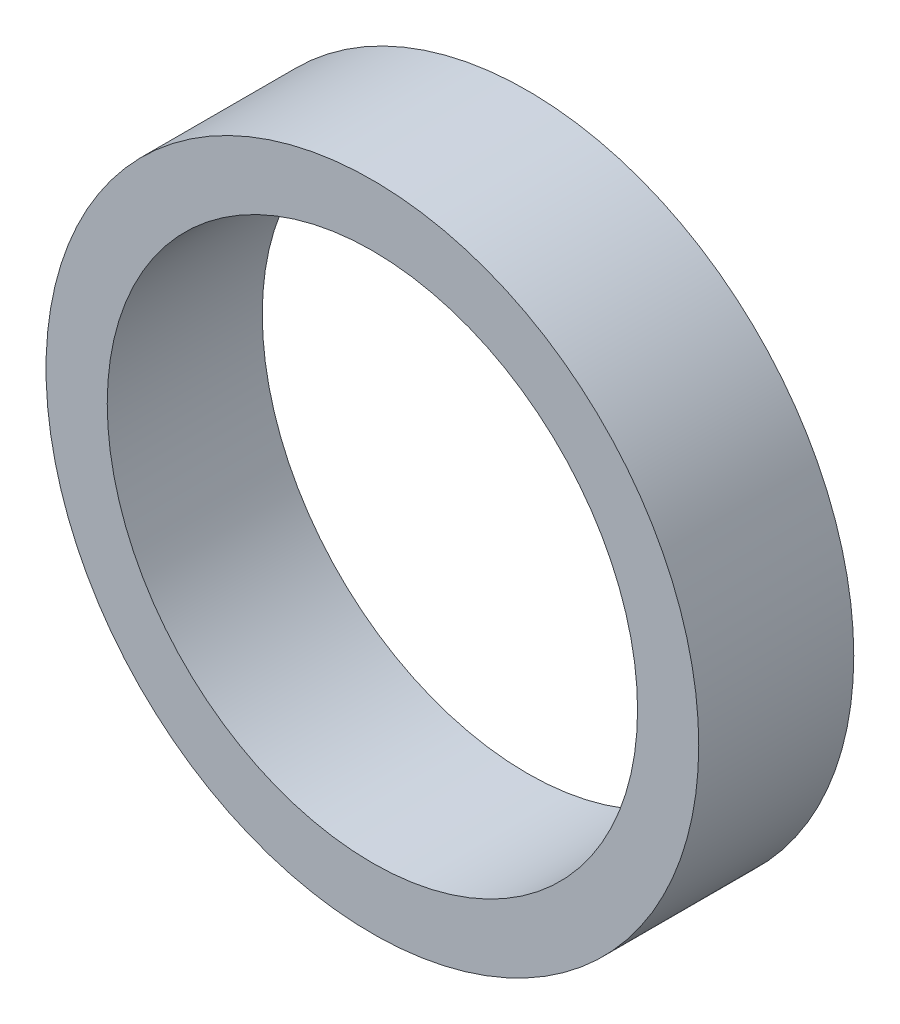
ISO-10303-21;
HEADER;
FILE_DESCRIPTION(('STEP AP214'),'2;1');
FILE_NAME('part.step','',(''),(''),'','','');
FILE_SCHEMA(('AUTOMOTIVE_DESIGN { 1 0 10303 214 1 1 1 1 }'));
ENDSEC;
DATA;
#1=APPLICATION_CONTEXT('core data for automotive mechanical design processes');
#2=APPLICATION_PROTOCOL_DEFINITION('international standard','automotive_design',2000,#1);
#3=PRODUCT_CONTEXT('',#1,'mechanical');
#4=PRODUCT('Part','Part','',(#3));
#5=PRODUCT_RELATED_PRODUCT_CATEGORY('part','',(#4));
#6=PRODUCT_DEFINITION_FORMATION('','',#4);
#7=PRODUCT_DEFINITION_CONTEXT('part definition',#1,'design');
#8=PRODUCT_DEFINITION('design','',#6,#7);
#9=PRODUCT_DEFINITION_SHAPE('','',#8);
#10=(LENGTH_UNIT() NAMED_UNIT(*) SI_UNIT(.MILLI.,.METRE.));
#11=(NAMED_UNIT(*) PLANE_ANGLE_UNIT() SI_UNIT($,.RADIAN.));
#12=(NAMED_UNIT(*) SI_UNIT($,.STERADIAN.) SOLID_ANGLE_UNIT());
#13=UNCERTAINTY_MEASURE_WITH_UNIT(LENGTH_MEASURE(1.E-05),#10,'distance_accuracy_value','');
#14=(GEOMETRIC_REPRESENTATION_CONTEXT(3) GLOBAL_UNCERTAINTY_ASSIGNED_CONTEXT((#13)) GLOBAL_UNIT_ASSIGNED_CONTEXT((#10,
#11,#12)) REPRESENTATION_CONTEXT('',''));
#15=CARTESIAN_POINT('',(0.,0.,0.));
#16=DIRECTION('',(0.,0.,1.));
#17=DIRECTION('',(1.,0.,0.));
#18=AXIS2_PLACEMENT_3D('',#15,#16,#17);
#19=CARTESIAN_POINT('',(0.,0.,19.));
#20=DIRECTION('',(0.,0.,1.));
#21=DIRECTION('',(1.,0.,0.));
#22=AXIS2_PLACEMENT_3D('',#19,#20,#21);
#23=PLANE('',#22);
#24=CARTESIAN_POINT('',(0.,0.,19.));
#25=DIRECTION('',(0.,0.,1.));
#26=DIRECTION('',(1.,0.,0.));
#27=AXIS2_PLACEMENT_3D('',#24,#25,#26);
#28=CIRCLE('',#27,40.);
#29=CARTESIAN_POINT('',(40.,0.,19.));
#30=VERTEX_POINT('',#29);
#31=EDGE_CURVE('E10',#30,#30,#28,.T.);
#32=ORIENTED_EDGE('',*,*,#31,.T.);
#33=EDGE_LOOP('',(#32));
#34=FACE_BOUND('',#33,.T.);
#35=CARTESIAN_POINT('',(0.,0.,19.));
#36=DIRECTION('',(0.,0.,1.));
#37=DIRECTION('',(1.,0.,0.));
#38=AXIS2_PLACEMENT_3D('',#35,#36,#37);
#39=CIRCLE('',#38,32.5);
#40=CARTESIAN_POINT('',(32.5,0.,19.));
#41=VERTEX_POINT('',#40);
#42=EDGE_CURVE('E52',#41,#41,#39,.T.);
#43=ORIENTED_EDGE('',*,*,#42,.F.);
#44=EDGE_LOOP('',(#43));
#45=FACE_BOUND('',#44,.T.);
#46=ADVANCED_FACE('F41',(#34,#45),#23,.T.);
#47=CARTESIAN_POINT('',(0.,0.,0.));
#48=DIRECTION('',(0.,0.,1.));
#49=DIRECTION('',(1.,0.,0.));
#50=AXIS2_PLACEMENT_3D('',#47,#48,#49);
#51=PLANE('',#50);
#52=CARTESIAN_POINT('',(0.,0.,0.));
#53=DIRECTION('',(0.,0.,1.));
#54=DIRECTION('',(1.,0.,0.));
#55=AXIS2_PLACEMENT_3D('',#52,#53,#54);
#56=CIRCLE('',#55,40.);
#57=CARTESIAN_POINT('',(40.,0.,0.));
#58=VERTEX_POINT('',#57);
#59=EDGE_CURVE('E45',#58,#58,#56,.T.);
#60=ORIENTED_EDGE('',*,*,#59,.F.);
#61=EDGE_LOOP('',(#60));
#62=FACE_BOUND('',#61,.T.);
#63=CARTESIAN_POINT('',(0.,0.,0.));
#64=DIRECTION('',(0.,0.,1.));
#65=DIRECTION('',(1.,0.,0.));
#66=AXIS2_PLACEMENT_3D('',#63,#64,#65);
#67=CIRCLE('',#66,32.5);
#68=CARTESIAN_POINT('',(32.5,0.,0.));
#69=VERTEX_POINT('',#68);
#70=EDGE_CURVE('E54',#69,#69,#67,.T.);
#71=ORIENTED_EDGE('',*,*,#70,.T.);
#72=EDGE_LOOP('',(#71));
#73=FACE_BOUND('',#72,.T.);
#74=ADVANCED_FACE('F64',(#62,#73),#51,.F.);
#75=CARTESIAN_POINT('',(0.,0.,19.));
#76=DIRECTION('',(0.,0.,-1.));
#77=DIRECTION('',(-1.,0.,0.));
#78=AXIS2_PLACEMENT_3D('',#75,#76,#77);
#79=CYLINDRICAL_SURFACE('',#78,40.);
#80=ORIENTED_EDGE('',*,*,#31,.F.);
#81=EDGE_LOOP('',(#80));
#82=FACE_BOUND('',#81,.T.);
#83=ORIENTED_EDGE('',*,*,#59,.T.);
#84=EDGE_LOOP('',(#83));
#85=FACE_BOUND('',#84,.T.);
#86=ADVANCED_FACE('F43',(#82,#85),#79,.T.);
#87=CARTESIAN_POINT('',(0.,0.,19.));
#88=DIRECTION('',(0.,0.,-1.));
#89=DIRECTION('',(-1.,0.,0.));
#90=AXIS2_PLACEMENT_3D('',#87,#88,#89);
#91=CYLINDRICAL_SURFACE('',#90,32.5);
#92=ORIENTED_EDGE('',*,*,#42,.T.);
#93=EDGE_LOOP('',(#92));
#94=FACE_BOUND('',#93,.T.);
#95=ORIENTED_EDGE('',*,*,#70,.F.);
#96=EDGE_LOOP('',(#95));
#97=FACE_BOUND('',#96,.T.);
#98=ADVANCED_FACE('F60',(#94,#97),#91,.F.);
#99=CLOSED_SHELL('',(#46,#74,#86,#98));
#100=MANIFOLD_SOLID_BREP('B2',#99);
#101=ADVANCED_BREP_SHAPE_REPRESENTATION('',(#18,#100),#14);
#102=SHAPE_DEFINITION_REPRESENTATION(#9,#101);
ENDSEC;
END-ISO-10303-21;
